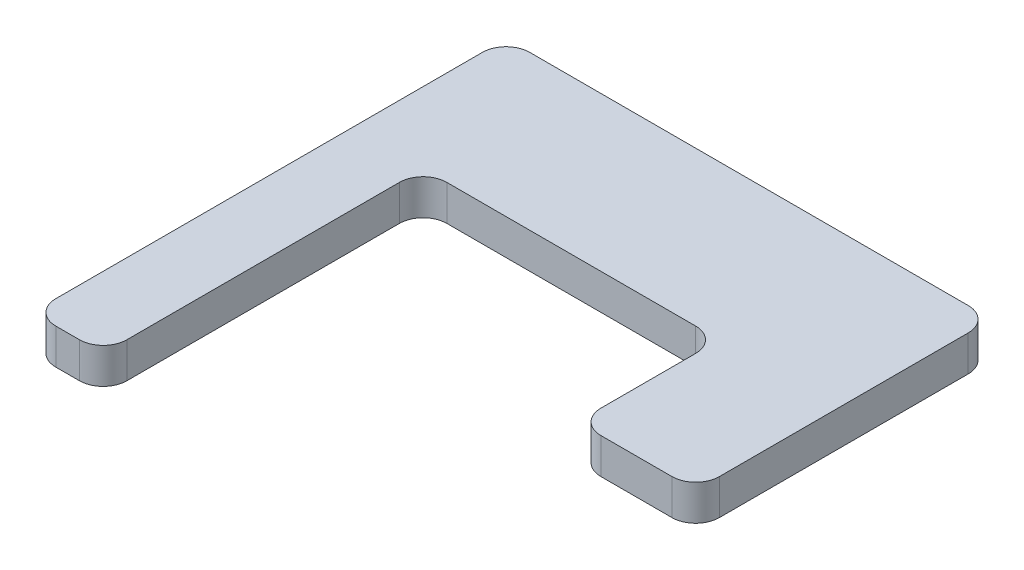
ISO-10303-21;
HEADER;
FILE_DESCRIPTION(('STEP AP214'),'2;1');
FILE_NAME('part.step','',(''),(''),'','','');
FILE_SCHEMA(('AUTOMOTIVE_DESIGN { 1 0 10303 214 1 1 1 1 }'));
ENDSEC;
DATA;
#1=APPLICATION_CONTEXT('core data for automotive mechanical design processes');
#2=APPLICATION_PROTOCOL_DEFINITION('international standard','automotive_design',2000,#1);
#3=PRODUCT_CONTEXT('',#1,'mechanical');
#4=PRODUCT('Part','Part','',(#3));
#5=PRODUCT_RELATED_PRODUCT_CATEGORY('part','',(#4));
#6=PRODUCT_DEFINITION_FORMATION('','',#4);
#7=PRODUCT_DEFINITION_CONTEXT('part definition',#1,'design');
#8=PRODUCT_DEFINITION('design','',#6,#7);
#9=PRODUCT_DEFINITION_SHAPE('','',#8);
#10=(LENGTH_UNIT() NAMED_UNIT(*) SI_UNIT(.MILLI.,.METRE.));
#11=(NAMED_UNIT(*) PLANE_ANGLE_UNIT() SI_UNIT($,.RADIAN.));
#12=(NAMED_UNIT(*) SI_UNIT($,.STERADIAN.) SOLID_ANGLE_UNIT());
#13=UNCERTAINTY_MEASURE_WITH_UNIT(LENGTH_MEASURE(1.E-05),#10,'distance_accuracy_value','');
#14=(GEOMETRIC_REPRESENTATION_CONTEXT(3) GLOBAL_UNCERTAINTY_ASSIGNED_CONTEXT((#13)) GLOBAL_UNIT_ASSIGNED_CONTEXT((#10,
#11,#12)) REPRESENTATION_CONTEXT('',''));
#15=CARTESIAN_POINT('',(0.,0.,0.));
#16=DIRECTION('',(0.,0.,1.));
#17=DIRECTION('',(1.,0.,0.));
#18=AXIS2_PLACEMENT_3D('',#15,#16,#17);
#19=CARTESIAN_POINT('',(-19.3488734471622,3.,33.9866415179758));
#20=DIRECTION('',(1.,0.,0.));
#21=DIRECTION('',(0.,0.,-1.));
#22=AXIS2_PLACEMENT_3D('',#19,#20,#21);
#23=PLANE('',#22);
#24=DIRECTION('',(0.,0.,1.));
#25=VECTOR('',#24,1.);
#26=CARTESIAN_POINT('',(-19.3488734471622,0.,33.9866415179758));
#27=LINE('',#26,#25);
#28=CARTESIAN_POINT('',(-19.3488734471622,0.,-4.01335848202419));
#29=VERTEX_POINT('',#28);
#30=CARTESIAN_POINT('',(-19.3488734471622,0.,31.9866415179758));
#31=VERTEX_POINT('',#30);
#32=EDGE_CURVE('E365',#29,#31,#27,.T.);
#33=ORIENTED_EDGE('',*,*,#32,.T.);
#34=DIRECTION('',(0.,-1.,0.));
#35=VECTOR('',#34,1.);
#36=CARTESIAN_POINT('',(-19.3488734471622,3.,31.9866415179758));
#37=LINE('',#36,#35);
#38=CARTESIAN_POINT('',(-19.3488734471622,3.,31.9866415179758));
#39=VERTEX_POINT('',#38);
#40=EDGE_CURVE('E176',#31,#39,#37,.F.);
#41=ORIENTED_EDGE('',*,*,#40,.T.);
#42=DIRECTION('',(0.,0.,1.));
#43=VECTOR('',#42,1.);
#44=CARTESIAN_POINT('',(-19.3488734471622,3.,33.9866415179758));
#45=LINE('',#44,#43);
#46=CARTESIAN_POINT('',(-19.3488734471622,3.,-4.01335848202419));
#47=VERTEX_POINT('',#46);
#48=EDGE_CURVE('E212',#47,#39,#45,.T.);
#49=ORIENTED_EDGE('',*,*,#48,.F.);
#50=DIRECTION('',(0.,-1.,0.));
#51=VECTOR('',#50,1.);
#52=CARTESIAN_POINT('',(-19.3488734471622,3.,-4.01335848202419));
#53=LINE('',#52,#51);
#54=EDGE_CURVE('E289',#47,#29,#53,.T.);
#55=ORIENTED_EDGE('',*,*,#54,.T.);
#56=EDGE_LOOP('',(#33,#41,#49,#55));
#57=FACE_BOUND('',#56,.T.);
#58=ADVANCED_FACE('F48',(#57),#23,.F.);
#59=CARTESIAN_POINT('',(-13.3488734471622,3.,33.9866415179758));
#60=DIRECTION('',(0.,0.,-1.));
#61=DIRECTION('',(-1.,0.,0.));
#62=AXIS2_PLACEMENT_3D('',#59,#60,#61);
#63=PLANE('',#62);
#64=DIRECTION('',(1.,0.,0.));
#65=VECTOR('',#64,1.);
#66=CARTESIAN_POINT('',(-13.3488734471622,0.,33.9866415179758));
#67=LINE('',#66,#65);
#68=CARTESIAN_POINT('',(-17.3488734471622,0.,33.9866415179758));
#69=VERTEX_POINT('',#68);
#70=CARTESIAN_POINT('',(-15.3488734471622,0.,33.9866415179758));
#71=VERTEX_POINT('',#70);
#72=EDGE_CURVE('E369',#69,#71,#67,.T.);
#73=ORIENTED_EDGE('',*,*,#72,.T.);
#74=DIRECTION('',(0.,-1.,0.));
#75=VECTOR('',#74,1.);
#76=CARTESIAN_POINT('',(-15.3488734471622,3.,33.9866415179758));
#77=LINE('',#76,#75);
#78=CARTESIAN_POINT('',(-15.3488734471622,3.,33.9866415179758));
#79=VERTEX_POINT('',#78);
#80=EDGE_CURVE('E286',#71,#79,#77,.F.);
#81=ORIENTED_EDGE('',*,*,#80,.T.);
#82=DIRECTION('',(1.,0.,0.));
#83=VECTOR('',#82,1.);
#84=CARTESIAN_POINT('',(-13.3488734471622,3.,33.9866415179758));
#85=LINE('',#84,#83);
#86=CARTESIAN_POINT('',(-17.3488734471622,3.,33.9866415179758));
#87=VERTEX_POINT('',#86);
#88=EDGE_CURVE('E328',#87,#79,#85,.T.);
#89=ORIENTED_EDGE('',*,*,#88,.F.);
#90=DIRECTION('',(0.,-1.,0.));
#91=VECTOR('',#90,1.);
#92=CARTESIAN_POINT('',(-17.3488734471622,3.,33.9866415179758));
#93=LINE('',#92,#91);
#94=EDGE_CURVE('E282',#87,#69,#93,.T.);
#95=ORIENTED_EDGE('',*,*,#94,.T.);
#96=EDGE_LOOP('',(#73,#81,#89,#95));
#97=FACE_BOUND('',#96,.T.);
#98=ADVANCED_FACE('F380',(#97),#63,.F.);
#99=CARTESIAN_POINT('',(-13.3488734471622,3.,6.98664151797582));
#100=DIRECTION('',(-1.,0.,0.));
#101=DIRECTION('',(0.,0.,1.));
#102=AXIS2_PLACEMENT_3D('',#99,#100,#101);
#103=PLANE('',#102);
#104=DIRECTION('',(0.,0.,-1.));
#105=VECTOR('',#104,1.);
#106=CARTESIAN_POINT('',(-13.3488734471622,0.,6.98664151797582));
#107=LINE('',#106,#105);
#108=CARTESIAN_POINT('',(-13.3488734471622,0.,31.9866415179758));
#109=VERTEX_POINT('',#108);
#110=CARTESIAN_POINT('',(-13.3488734471622,0.,8.98664151797582));
#111=VERTEX_POINT('',#110);
#112=EDGE_CURVE('E201',#109,#111,#107,.T.);
#113=ORIENTED_EDGE('',*,*,#112,.T.);
#114=DIRECTION('',(0.,-1.,0.));
#115=VECTOR('',#114,1.);
#116=CARTESIAN_POINT('',(-13.3488734471622,3.,8.98664151797582));
#117=LINE('',#116,#115);
#118=CARTESIAN_POINT('',(-13.3488734471622,3.,8.98664151797582));
#119=VERTEX_POINT('',#118);
#120=EDGE_CURVE('E225',#111,#119,#117,.F.);
#121=ORIENTED_EDGE('',*,*,#120,.T.);
#122=DIRECTION('',(0.,0.,-1.));
#123=VECTOR('',#122,1.);
#124=CARTESIAN_POINT('',(-13.3488734471622,3.,6.98664151797582));
#125=LINE('',#124,#123);
#126=CARTESIAN_POINT('',(-13.3488734471622,3.,31.9866415179758));
#127=VERTEX_POINT('',#126);
#128=EDGE_CURVE('E332',#127,#119,#125,.T.);
#129=ORIENTED_EDGE('',*,*,#128,.F.);
#130=DIRECTION('',(0.,-1.,0.));
#131=VECTOR('',#130,1.);
#132=CARTESIAN_POINT('',(-13.3488734471622,3.,31.9866415179758));
#133=LINE('',#132,#131);
#134=EDGE_CURVE('E221',#127,#109,#133,.T.);
#135=ORIENTED_EDGE('',*,*,#134,.T.);
#136=EDGE_LOOP('',(#113,#121,#129,#135));
#137=FACE_BOUND('',#136,.T.);
#138=ADVANCED_FACE('F375',(#137),#103,.F.);
#139=CARTESIAN_POINT('',(11.6511265528378,3.,6.98664151797581));
#140=DIRECTION('',(0.,0.,-1.));
#141=DIRECTION('',(-1.,0.,0.));
#142=AXIS2_PLACEMENT_3D('',#139,#140,#141);
#143=PLANE('',#142);
#144=DIRECTION('',(1.,0.,0.));
#145=VECTOR('',#144,1.);
#146=CARTESIAN_POINT('',(11.6511265528378,0.,6.98664151797581));
#147=LINE('',#146,#145);
#148=CARTESIAN_POINT('',(-11.3488734471622,0.,6.98664151797582));
#149=VERTEX_POINT('',#148);
#150=CARTESIAN_POINT('',(9.65112655283785,0.,6.98664151797581));
#151=VERTEX_POINT('',#150);
#152=EDGE_CURVE('E195',#149,#151,#147,.T.);
#153=ORIENTED_EDGE('',*,*,#152,.T.);
#154=DIRECTION('',(0.,-1.,0.));
#155=VECTOR('',#154,1.);
#156=CARTESIAN_POINT('',(9.65112655283785,3.,6.98664151797581));
#157=LINE('',#156,#155);
#158=CARTESIAN_POINT('',(9.65112655283785,3.,6.98664151797581));
#159=VERTEX_POINT('',#158);
#160=EDGE_CURVE('E169',#151,#159,#157,.F.);
#161=ORIENTED_EDGE('',*,*,#160,.T.);
#162=DIRECTION('',(1.,0.,0.));
#163=VECTOR('',#162,1.);
#164=CARTESIAN_POINT('',(11.6511265528378,3.,6.98664151797581));
#165=LINE('',#164,#163);
#166=CARTESIAN_POINT('',(-11.3488734471622,3.,6.98664151797582));
#167=VERTEX_POINT('',#166);
#168=EDGE_CURVE('E305',#167,#159,#165,.T.);
#169=ORIENTED_EDGE('',*,*,#168,.F.);
#170=DIRECTION('',(0.,-1.,0.));
#171=VECTOR('',#170,1.);
#172=CARTESIAN_POINT('',(-11.3488734471622,0.,6.98664151797582));
#173=LINE('',#172,#171);
#174=EDGE_CURVE('E186',#167,#149,#173,.T.);
#175=ORIENTED_EDGE('',*,*,#174,.T.);
#176=EDGE_LOOP('',(#153,#161,#169,#175));
#177=FACE_BOUND('',#176,.T.);
#178=ADVANCED_FACE('F344',(#177),#143,.F.);
#179=CARTESIAN_POINT('',(11.6511265528378,3.,18.9866415179758));
#180=DIRECTION('',(1.,0.,0.));
#181=DIRECTION('',(0.,0.,-1.));
#182=AXIS2_PLACEMENT_3D('',#179,#180,#181);
#183=PLANE('',#182);
#184=DIRECTION('',(0.,0.,1.));
#185=VECTOR('',#184,1.);
#186=CARTESIAN_POINT('',(11.6511265528378,3.,18.9866415179758));
#187=LINE('',#186,#185);
#188=CARTESIAN_POINT('',(11.6511265528378,3.,8.98664151797582));
#189=VERTEX_POINT('',#188);
#190=CARTESIAN_POINT('',(11.6511265528378,3.,16.9866415179758));
#191=VERTEX_POINT('',#190);
#192=EDGE_CURVE('E184',#189,#191,#187,.T.);
#193=ORIENTED_EDGE('',*,*,#192,.F.);
#194=DIRECTION('',(0.,-1.,0.));
#195=VECTOR('',#194,1.);
#196=CARTESIAN_POINT('',(11.6511265528378,0.,8.98664151797582));
#197=LINE('',#196,#195);
#198=CARTESIAN_POINT('',(11.6511265528378,0.,8.98664151797582));
#199=VERTEX_POINT('',#198);
#200=EDGE_CURVE('E168',#189,#199,#197,.T.);
#201=ORIENTED_EDGE('',*,*,#200,.T.);
#202=DIRECTION('',(0.,0.,1.));
#203=VECTOR('',#202,1.);
#204=CARTESIAN_POINT('',(11.6511265528378,0.,18.9866415179758));
#205=LINE('',#204,#203);
#206=CARTESIAN_POINT('',(11.6511265528378,0.,16.9866415179758));
#207=VERTEX_POINT('',#206);
#208=EDGE_CURVE('E182',#199,#207,#205,.T.);
#209=ORIENTED_EDGE('',*,*,#208,.T.);
#210=DIRECTION('',(0.,-1.,0.));
#211=VECTOR('',#210,1.);
#212=CARTESIAN_POINT('',(11.6511265528378,3.,16.9866415179758));
#213=LINE('',#212,#211);
#214=EDGE_CURVE('E187',#207,#191,#213,.F.);
#215=ORIENTED_EDGE('',*,*,#214,.T.);
#216=EDGE_LOOP('',(#193,#201,#209,#215));
#217=FACE_BOUND('',#216,.T.);
#218=ADVANCED_FACE('F181',(#217),#183,.F.);
#219=CARTESIAN_POINT('',(21.6511265528379,3.,18.9866415179758));
#220=DIRECTION('',(0.,0.,-1.));
#221=DIRECTION('',(-1.,0.,0.));
#222=AXIS2_PLACEMENT_3D('',#219,#220,#221);
#223=PLANE('',#222);
#224=DIRECTION('',(1.,0.,0.));
#225=VECTOR('',#224,1.);
#226=CARTESIAN_POINT('',(21.6511265528379,0.,18.9866415179758));
#227=LINE('',#226,#225);
#228=CARTESIAN_POINT('',(13.6511265528378,0.,18.9866415179758));
#229=VERTEX_POINT('',#228);
#230=CARTESIAN_POINT('',(19.6511265528379,0.,18.9866415179758));
#231=VERTEX_POINT('',#230);
#232=EDGE_CURVE('E194',#229,#231,#227,.T.);
#233=ORIENTED_EDGE('',*,*,#232,.T.);
#234=DIRECTION('',(0.,-1.,0.));
#235=VECTOR('',#234,1.);
#236=CARTESIAN_POINT('',(19.6511265528379,3.,18.9866415179758));
#237=LINE('',#236,#235);
#238=CARTESIAN_POINT('',(19.6511265528379,3.,18.9866415179758));
#239=VERTEX_POINT('',#238);
#240=EDGE_CURVE('E65',#231,#239,#237,.F.);
#241=ORIENTED_EDGE('',*,*,#240,.T.);
#242=DIRECTION('',(1.,0.,0.));
#243=VECTOR('',#242,1.);
#244=CARTESIAN_POINT('',(21.6511265528379,3.,18.9866415179758));
#245=LINE('',#244,#243);
#246=CARTESIAN_POINT('',(13.6511265528378,3.,18.9866415179758));
#247=VERTEX_POINT('',#246);
#248=EDGE_CURVE('E304',#247,#239,#245,.T.);
#249=ORIENTED_EDGE('',*,*,#248,.F.);
#250=DIRECTION('',(0.,-1.,0.));
#251=VECTOR('',#250,1.);
#252=CARTESIAN_POINT('',(13.6511265528378,3.,18.9866415179758));
#253=LINE('',#252,#251);
#254=EDGE_CURVE('E276',#247,#229,#253,.T.);
#255=ORIENTED_EDGE('',*,*,#254,.T.);
#256=EDGE_LOOP('',(#233,#241,#249,#255));
#257=FACE_BOUND('',#256,.T.);
#258=ADVANCED_FACE('F420',(#257),#223,.F.);
#259=CARTESIAN_POINT('',(21.6511265528378,3.,-6.01335848202418));
#260=DIRECTION('',(-1.,0.,0.));
#261=DIRECTION('',(0.,0.,1.));
#262=AXIS2_PLACEMENT_3D('',#259,#260,#261);
#263=PLANE('',#262);
#264=DIRECTION('',(0.,0.,-1.));
#265=VECTOR('',#264,1.);
#266=CARTESIAN_POINT('',(21.6511265528378,0.,-6.01335848202418));
#267=LINE('',#266,#265);
#268=CARTESIAN_POINT('',(21.6511265528379,0.,16.9866415179758));
#269=VERTEX_POINT('',#268);
#270=CARTESIAN_POINT('',(21.6511265528378,0.,-4.01335848202418));
#271=VERTEX_POINT('',#270);
#272=EDGE_CURVE('E199',#269,#271,#267,.T.);
#273=ORIENTED_EDGE('',*,*,#272,.T.);
#274=DIRECTION('',(0.,-1.,0.));
#275=VECTOR('',#274,1.);
#276=CARTESIAN_POINT('',(21.6511265528378,3.,-4.01335848202418));
#277=LINE('',#276,#275);
#278=CARTESIAN_POINT('',(21.6511265528378,3.,-4.01335848202418));
#279=VERTEX_POINT('',#278);
#280=EDGE_CURVE('E256',#271,#279,#277,.F.);
#281=ORIENTED_EDGE('',*,*,#280,.T.);
#282=DIRECTION('',(0.,0.,-1.));
#283=VECTOR('',#282,1.);
#284=CARTESIAN_POINT('',(21.6511265528378,3.,-6.01335848202418));
#285=LINE('',#284,#283);
#286=CARTESIAN_POINT('',(21.6511265528379,3.,16.9866415179758));
#287=VERTEX_POINT('',#286);
#288=EDGE_CURVE('E311',#287,#279,#285,.T.);
#289=ORIENTED_EDGE('',*,*,#288,.F.);
#290=DIRECTION('',(0.,-1.,0.));
#291=VECTOR('',#290,1.);
#292=CARTESIAN_POINT('',(21.6511265528379,3.,16.9866415179758));
#293=LINE('',#292,#291);
#294=EDGE_CURVE('E252',#287,#269,#293,.T.);
#295=ORIENTED_EDGE('',*,*,#294,.T.);
#296=EDGE_LOOP('',(#273,#281,#289,#295));
#297=FACE_BOUND('',#296,.T.);
#298=ADVANCED_FACE('F426',(#297),#263,.F.);
#299=CARTESIAN_POINT('',(-19.3488734471622,3.,-6.01335848202418));
#300=DIRECTION('',(0.,0.,1.));
#301=DIRECTION('',(1.,0.,0.));
#302=AXIS2_PLACEMENT_3D('',#299,#300,#301);
#303=PLANE('',#302);
#304=DIRECTION('',(-1.,0.,0.));
#305=VECTOR('',#304,1.);
#306=CARTESIAN_POINT('',(-19.3488734471622,3.,-6.01335848202418));
#307=LINE('',#306,#305);
#308=CARTESIAN_POINT('',(19.6511265528379,3.,-6.01335848202418));
#309=VERTEX_POINT('',#308);
#310=CARTESIAN_POINT('',(-17.3488734471622,3.,-6.01335848202418));
#311=VERTEX_POINT('',#310);
#312=EDGE_CURVE('E214',#309,#311,#307,.T.);
#313=ORIENTED_EDGE('',*,*,#312,.F.);
#314=DIRECTION('',(0.,-1.,0.));
#315=VECTOR('',#314,1.);
#316=CARTESIAN_POINT('',(19.6511265528379,3.,-6.01335848202418));
#317=LINE('',#316,#315);
#318=CARTESIAN_POINT('',(19.6511265528379,0.,-6.01335848202418));
#319=VERTEX_POINT('',#318);
#320=EDGE_CURVE('E231',#309,#319,#317,.T.);
#321=ORIENTED_EDGE('',*,*,#320,.T.);
#322=DIRECTION('',(-1.,0.,0.));
#323=VECTOR('',#322,1.);
#324=CARTESIAN_POINT('',(-19.3488734471622,0.,-6.01335848202418));
#325=LINE('',#324,#323);
#326=CARTESIAN_POINT('',(-17.3488734471622,0.,-6.01335848202418));
#327=VERTEX_POINT('',#326);
#328=EDGE_CURVE('E208',#319,#327,#325,.T.);
#329=ORIENTED_EDGE('',*,*,#328,.T.);
#330=DIRECTION('',(0.,-1.,0.));
#331=VECTOR('',#330,1.);
#332=CARTESIAN_POINT('',(-17.3488734471622,3.,-6.01335848202418));
#333=LINE('',#332,#331);
#334=EDGE_CURVE('E228',#327,#311,#333,.F.);
#335=ORIENTED_EDGE('',*,*,#334,.T.);
#336=EDGE_LOOP('',(#313,#321,#329,#335));
#337=FACE_BOUND('',#336,.T.);
#338=ADVANCED_FACE('F428',(#337),#303,.F.);
#339=CARTESIAN_POINT('',(0.,3.,0.));
#340=DIRECTION('',(0.,-1.,0.));
#341=DIRECTION('',(0.,0.,-1.));
#342=AXIS2_PLACEMENT_3D('',#339,#340,#341);
#343=PLANE('',#342);
#344=ORIENTED_EDGE('',*,*,#288,.T.);
#345=CARTESIAN_POINT('',(19.6511265528379,3.,-4.01335848202418));
#346=DIRECTION('',(0.,-1.,0.));
#347=DIRECTION('',(0.,0.,-1.));
#348=AXIS2_PLACEMENT_3D('',#345,#346,#347);
#349=CIRCLE('',#348,2.);
#350=EDGE_CURVE('E273',#279,#309,#349,.F.);
#351=ORIENTED_EDGE('',*,*,#350,.T.);
#352=ORIENTED_EDGE('',*,*,#312,.T.);
#353=CARTESIAN_POINT('',(-17.3488734471622,3.,-4.01335848202419));
#354=DIRECTION('',(0.,-1.,0.));
#355=DIRECTION('',(0.,0.,-1.));
#356=AXIS2_PLACEMENT_3D('',#353,#354,#355);
#357=CIRCLE('',#356,2.);
#358=EDGE_CURVE('E259',#311,#47,#357,.F.);
#359=ORIENTED_EDGE('',*,*,#358,.T.);
#360=ORIENTED_EDGE('',*,*,#48,.T.);
#361=CARTESIAN_POINT('',(-17.3488734471622,3.,31.9866415179758));
#362=DIRECTION('',(0.,-1.,0.));
#363=DIRECTION('',(0.,0.,-1.));
#364=AXIS2_PLACEMENT_3D('',#361,#362,#363);
#365=CIRCLE('',#364,2.);
#366=EDGE_CURVE('E262',#39,#87,#365,.F.);
#367=ORIENTED_EDGE('',*,*,#366,.T.);
#368=ORIENTED_EDGE('',*,*,#88,.T.);
#369=CARTESIAN_POINT('',(-15.3488734471622,3.,31.9866415179758));
#370=DIRECTION('',(0.,-1.,0.));
#371=DIRECTION('',(0.,0.,-1.));
#372=AXIS2_PLACEMENT_3D('',#369,#370,#371);
#373=CIRCLE('',#372,2.);
#374=EDGE_CURVE('E265',#79,#127,#373,.F.);
#375=ORIENTED_EDGE('',*,*,#374,.T.);
#376=ORIENTED_EDGE('',*,*,#128,.T.);
#377=CARTESIAN_POINT('',(-11.3488734471622,3.,8.98664151797582));
#378=DIRECTION('',(0.,-1.,0.));
#379=DIRECTION('',(0.,0.,-1.));
#380=AXIS2_PLACEMENT_3D('',#377,#378,#379);
#381=CIRCLE('',#380,2.);
#382=EDGE_CURVE('E12',#119,#167,#381,.T.);
#383=ORIENTED_EDGE('',*,*,#382,.T.);
#384=ORIENTED_EDGE('',*,*,#168,.T.);
#385=CARTESIAN_POINT('',(9.65112655283785,3.,8.98664151797582));
#386=DIRECTION('',(0.,-1.,0.));
#387=DIRECTION('',(0.,0.,-1.));
#388=AXIS2_PLACEMENT_3D('',#385,#386,#387);
#389=CIRCLE('',#388,2.);
#390=EDGE_CURVE('E175',#159,#189,#389,.T.);
#391=ORIENTED_EDGE('',*,*,#390,.T.);
#392=ORIENTED_EDGE('',*,*,#192,.T.);
#393=CARTESIAN_POINT('',(13.6511265528378,3.,16.9866415179758));
#394=DIRECTION('',(0.,-1.,0.));
#395=DIRECTION('',(0.,0.,-1.));
#396=AXIS2_PLACEMENT_3D('',#393,#394,#395);
#397=CIRCLE('',#396,2.);
#398=EDGE_CURVE('E72',#191,#247,#397,.F.);
#399=ORIENTED_EDGE('',*,*,#398,.T.);
#400=ORIENTED_EDGE('',*,*,#248,.T.);
#401=CARTESIAN_POINT('',(19.6511265528379,3.,16.9866415179758));
#402=DIRECTION('',(0.,-1.,0.));
#403=DIRECTION('',(0.,0.,-1.));
#404=AXIS2_PLACEMENT_3D('',#401,#402,#403);
#405=CIRCLE('',#404,2.);
#406=EDGE_CURVE('E270',#239,#287,#405,.F.);
#407=ORIENTED_EDGE('',*,*,#406,.T.);
#408=EDGE_LOOP('',(#344,#351,#352,#359,#360,#367,#368,#375,#376,#383,#384,#391,#392,#399,#400,#407));
#409=FACE_BOUND('',#408,.T.);
#410=ADVANCED_FACE('F341',(#409),#343,.F.);
#411=CARTESIAN_POINT('',(0.,0.,0.));
#412=DIRECTION('',(0.,-1.,0.));
#413=DIRECTION('',(0.,0.,-1.));
#414=AXIS2_PLACEMENT_3D('',#411,#412,#413);
#415=PLANE('',#414);
#416=ORIENTED_EDGE('',*,*,#328,.F.);
#417=CARTESIAN_POINT('',(19.6511265528379,0.,-4.01335848202418));
#418=DIRECTION('',(0.,-1.,0.));
#419=DIRECTION('',(0.,0.,-1.));
#420=AXIS2_PLACEMENT_3D('',#417,#418,#419);
#421=CIRCLE('',#420,2.);
#422=EDGE_CURVE('E249',#319,#271,#421,.T.);
#423=ORIENTED_EDGE('',*,*,#422,.T.);
#424=ORIENTED_EDGE('',*,*,#272,.F.);
#425=CARTESIAN_POINT('',(19.6511265528379,0.,16.9866415179758));
#426=DIRECTION('',(0.,-1.,0.));
#427=DIRECTION('',(0.,0.,-1.));
#428=AXIS2_PLACEMENT_3D('',#425,#426,#427);
#429=CIRCLE('',#428,2.);
#430=EDGE_CURVE('E246',#269,#231,#429,.T.);
#431=ORIENTED_EDGE('',*,*,#430,.T.);
#432=ORIENTED_EDGE('',*,*,#232,.F.);
#433=CARTESIAN_POINT('',(13.6511265528378,0.,16.9866415179758));
#434=DIRECTION('',(0.,-1.,0.));
#435=DIRECTION('',(0.,0.,-1.));
#436=AXIS2_PLACEMENT_3D('',#433,#434,#435);
#437=CIRCLE('',#436,2.);
#438=EDGE_CURVE('E192',#229,#207,#437,.T.);
#439=ORIENTED_EDGE('',*,*,#438,.T.);
#440=ORIENTED_EDGE('',*,*,#208,.F.);
#441=CARTESIAN_POINT('',(9.65112655283785,0.,8.98664151797582));
#442=DIRECTION('',(0.,-1.,0.));
#443=DIRECTION('',(0.,0.,-1.));
#444=AXIS2_PLACEMENT_3D('',#441,#442,#443);
#445=CIRCLE('',#444,2.);
#446=EDGE_CURVE('E164',#199,#151,#445,.F.);
#447=ORIENTED_EDGE('',*,*,#446,.T.);
#448=ORIENTED_EDGE('',*,*,#152,.F.);
#449=CARTESIAN_POINT('',(-11.3488734471622,0.,8.98664151797582));
#450=DIRECTION('',(0.,-1.,0.));
#451=DIRECTION('',(0.,0.,-1.));
#452=AXIS2_PLACEMENT_3D('',#449,#450,#451);
#453=CIRCLE('',#452,2.);
#454=EDGE_CURVE('E58',#149,#111,#453,.F.);
#455=ORIENTED_EDGE('',*,*,#454,.T.);
#456=ORIENTED_EDGE('',*,*,#112,.F.);
#457=CARTESIAN_POINT('',(-15.3488734471622,0.,31.9866415179758));
#458=DIRECTION('',(0.,-1.,0.));
#459=DIRECTION('',(0.,0.,-1.));
#460=AXIS2_PLACEMENT_3D('',#457,#458,#459);
#461=CIRCLE('',#460,2.);
#462=EDGE_CURVE('E241',#109,#71,#461,.T.);
#463=ORIENTED_EDGE('',*,*,#462,.T.);
#464=ORIENTED_EDGE('',*,*,#72,.F.);
#465=CARTESIAN_POINT('',(-17.3488734471622,0.,31.9866415179758));
#466=DIRECTION('',(0.,-1.,0.));
#467=DIRECTION('',(0.,0.,-1.));
#468=AXIS2_PLACEMENT_3D('',#465,#466,#467);
#469=CIRCLE('',#468,2.);
#470=EDGE_CURVE('E238',#69,#31,#469,.T.);
#471=ORIENTED_EDGE('',*,*,#470,.T.);
#472=ORIENTED_EDGE('',*,*,#32,.F.);
#473=CARTESIAN_POINT('',(-17.3488734471622,0.,-4.01335848202419));
#474=DIRECTION('',(0.,-1.,0.));
#475=DIRECTION('',(0.,0.,-1.));
#476=AXIS2_PLACEMENT_3D('',#473,#474,#475);
#477=CIRCLE('',#476,2.);
#478=EDGE_CURVE('E235',#29,#327,#477,.T.);
#479=ORIENTED_EDGE('',*,*,#478,.T.);
#480=EDGE_LOOP('',(#416,#423,#424,#431,#432,#439,#440,#447,#448,#455,#456,#463,#464,#471,#472,#479));
#481=FACE_BOUND('',#480,.T.);
#482=ADVANCED_FACE('F190',(#481),#415,.T.);
#483=CARTESIAN_POINT('',(9.65112655283785,3.,8.98664151797582));
#484=DIRECTION('',(0.,1.,0.));
#485=DIRECTION('',(0.,0.,1.));
#486=AXIS2_PLACEMENT_3D('',#483,#484,#485);
#487=CYLINDRICAL_SURFACE('',#486,2.);
#488=ORIENTED_EDGE('',*,*,#390,.F.);
#489=ORIENTED_EDGE('',*,*,#160,.F.);
#490=ORIENTED_EDGE('',*,*,#446,.F.);
#491=ORIENTED_EDGE('',*,*,#200,.F.);
#492=EDGE_LOOP('',(#488,#489,#490,#491));
#493=FACE_BOUND('',#492,.T.);
#494=ADVANCED_FACE('F167',(#493),#487,.F.);
#495=CARTESIAN_POINT('',(-11.3488734471622,3.,8.98664151797582));
#496=DIRECTION('',(0.,1.,0.));
#497=DIRECTION('',(0.,0.,1.));
#498=AXIS2_PLACEMENT_3D('',#495,#496,#497);
#499=CYLINDRICAL_SURFACE('',#498,2.);
#500=ORIENTED_EDGE('',*,*,#382,.F.);
#501=ORIENTED_EDGE('',*,*,#120,.F.);
#502=ORIENTED_EDGE('',*,*,#454,.F.);
#503=ORIENTED_EDGE('',*,*,#174,.F.);
#504=EDGE_LOOP('',(#500,#501,#502,#503));
#505=FACE_BOUND('',#504,.T.);
#506=ADVANCED_FACE('F346',(#505),#499,.F.);
#507=CARTESIAN_POINT('',(19.6511265528379,3.,-4.01335848202418));
#508=DIRECTION('',(0.,-1.,0.));
#509=DIRECTION('',(0.,0.,-1.));
#510=AXIS2_PLACEMENT_3D('',#507,#508,#509);
#511=CYLINDRICAL_SURFACE('',#510,2.);
#512=ORIENTED_EDGE('',*,*,#350,.F.);
#513=ORIENTED_EDGE('',*,*,#280,.F.);
#514=ORIENTED_EDGE('',*,*,#422,.F.);
#515=ORIENTED_EDGE('',*,*,#320,.F.);
#516=EDGE_LOOP('',(#512,#513,#514,#515));
#517=FACE_BOUND('',#516,.T.);
#518=ADVANCED_FACE('F407',(#517),#511,.T.);
#519=CARTESIAN_POINT('',(19.6511265528379,3.,16.9866415179758));
#520=DIRECTION('',(0.,-1.,0.));
#521=DIRECTION('',(0.,0.,-1.));
#522=AXIS2_PLACEMENT_3D('',#519,#520,#521);
#523=CYLINDRICAL_SURFACE('',#522,2.);
#524=ORIENTED_EDGE('',*,*,#406,.F.);
#525=ORIENTED_EDGE('',*,*,#240,.F.);
#526=ORIENTED_EDGE('',*,*,#430,.F.);
#527=ORIENTED_EDGE('',*,*,#294,.F.);
#528=EDGE_LOOP('',(#524,#525,#526,#527));
#529=FACE_BOUND('',#528,.T.);
#530=ADVANCED_FACE('F410',(#529),#523,.T.);
#531=CARTESIAN_POINT('',(13.6511265528378,3.,16.9866415179758));
#532=DIRECTION('',(0.,-1.,0.));
#533=DIRECTION('',(0.,0.,-1.));
#534=AXIS2_PLACEMENT_3D('',#531,#532,#533);
#535=CYLINDRICAL_SURFACE('',#534,2.);
#536=ORIENTED_EDGE('',*,*,#398,.F.);
#537=ORIENTED_EDGE('',*,*,#214,.F.);
#538=ORIENTED_EDGE('',*,*,#438,.F.);
#539=ORIENTED_EDGE('',*,*,#254,.F.);
#540=EDGE_LOOP('',(#536,#537,#538,#539));
#541=FACE_BOUND('',#540,.T.);
#542=ADVANCED_FACE('F393',(#541),#535,.T.);
#543=CARTESIAN_POINT('',(-15.3488734471622,3.,31.9866415179758));
#544=DIRECTION('',(0.,-1.,0.));
#545=DIRECTION('',(0.,0.,-1.));
#546=AXIS2_PLACEMENT_3D('',#543,#544,#545);
#547=CYLINDRICAL_SURFACE('',#546,2.);
#548=ORIENTED_EDGE('',*,*,#374,.F.);
#549=ORIENTED_EDGE('',*,*,#80,.F.);
#550=ORIENTED_EDGE('',*,*,#462,.F.);
#551=ORIENTED_EDGE('',*,*,#134,.F.);
#552=EDGE_LOOP('',(#548,#549,#550,#551));
#553=FACE_BOUND('',#552,.T.);
#554=ADVANCED_FACE('F384',(#553),#547,.T.);
#555=CARTESIAN_POINT('',(-17.3488734471622,3.,31.9866415179758));
#556=DIRECTION('',(0.,-1.,0.));
#557=DIRECTION('',(0.,0.,-1.));
#558=AXIS2_PLACEMENT_3D('',#555,#556,#557);
#559=CYLINDRICAL_SURFACE('',#558,2.);
#560=ORIENTED_EDGE('',*,*,#366,.F.);
#561=ORIENTED_EDGE('',*,*,#40,.F.);
#562=ORIENTED_EDGE('',*,*,#470,.F.);
#563=ORIENTED_EDGE('',*,*,#94,.F.);
#564=EDGE_LOOP('',(#560,#561,#562,#563));
#565=FACE_BOUND('',#564,.T.);
#566=ADVANCED_FACE('F387',(#565),#559,.T.);
#567=CARTESIAN_POINT('',(-17.3488734471622,3.,-4.01335848202419));
#568=DIRECTION('',(0.,-1.,0.));
#569=DIRECTION('',(0.,0.,-1.));
#570=AXIS2_PLACEMENT_3D('',#567,#568,#569);
#571=CYLINDRICAL_SURFACE('',#570,2.);
#572=ORIENTED_EDGE('',*,*,#358,.F.);
#573=ORIENTED_EDGE('',*,*,#334,.F.);
#574=ORIENTED_EDGE('',*,*,#478,.F.);
#575=ORIENTED_EDGE('',*,*,#54,.F.);
#576=EDGE_LOOP('',(#572,#573,#574,#575));
#577=FACE_BOUND('',#576,.T.);
#578=ADVANCED_FACE('F50',(#577),#571,.T.);
#579=CLOSED_SHELL('',(#58,#98,#138,#178,#218,#258,#298,#338,#410,#482,#494,#506,#518,#530,#542,
#554,#566,#578));
#580=MANIFOLD_SOLID_BREP('B2',#579);
#581=ADVANCED_BREP_SHAPE_REPRESENTATION('',(#18,#580),#14);
#582=SHAPE_DEFINITION_REPRESENTATION(#9,#581);
ENDSEC;
END-ISO-10303-21;
